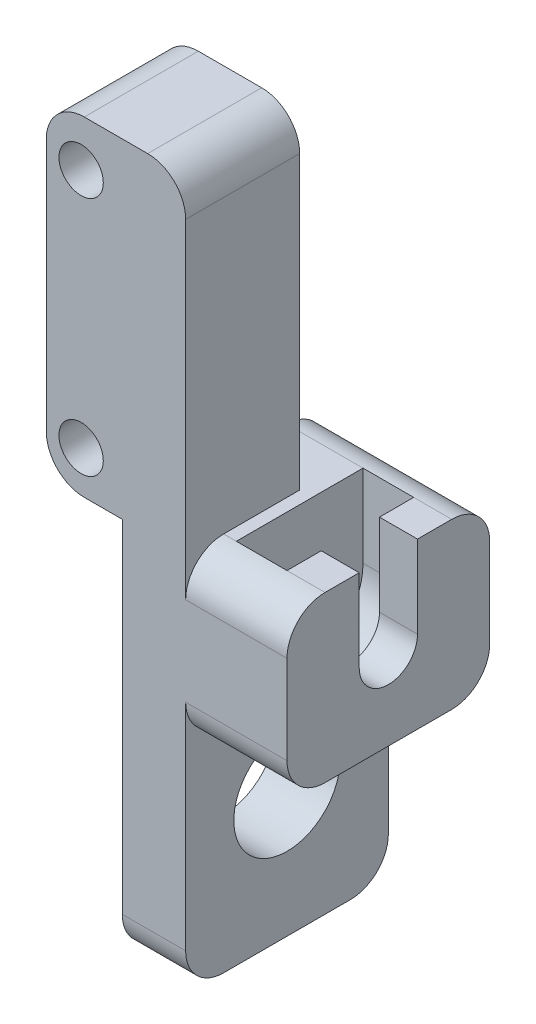
ISO-10303-21;
HEADER;
FILE_DESCRIPTION(('STEP AP214'),'2;1');
FILE_NAME('part.step','',(''),(''),'','','');
FILE_SCHEMA(('AUTOMOTIVE_DESIGN { 1 0 10303 214 1 1 1 1 }'));
ENDSEC;
DATA;
#1=APPLICATION_CONTEXT('core data for automotive mechanical design processes');
#2=APPLICATION_PROTOCOL_DEFINITION('international standard','automotive_design',2000,#1);
#3=PRODUCT_CONTEXT('',#1,'mechanical');
#4=PRODUCT('Part','Part','',(#3));
#5=PRODUCT_RELATED_PRODUCT_CATEGORY('part','',(#4));
#6=PRODUCT_DEFINITION_FORMATION('','',#4);
#7=PRODUCT_DEFINITION_CONTEXT('part definition',#1,'design');
#8=PRODUCT_DEFINITION('design','',#6,#7);
#9=PRODUCT_DEFINITION_SHAPE('','',#8);
#10=(LENGTH_UNIT() NAMED_UNIT(*) SI_UNIT(.MILLI.,.METRE.));
#11=(NAMED_UNIT(*) PLANE_ANGLE_UNIT() SI_UNIT($,.RADIAN.));
#12=(NAMED_UNIT(*) SI_UNIT($,.STERADIAN.) SOLID_ANGLE_UNIT());
#13=UNCERTAINTY_MEASURE_WITH_UNIT(LENGTH_MEASURE(1.E-05),#10,'distance_accuracy_value','');
#14=(GEOMETRIC_REPRESENTATION_CONTEXT(3) GLOBAL_UNCERTAINTY_ASSIGNED_CONTEXT((#13)) GLOBAL_UNIT_ASSIGNED_CONTEXT((#10,
#11,#12)) REPRESENTATION_CONTEXT('',''));
#15=CARTESIAN_POINT('',(0.,0.,0.));
#16=DIRECTION('',(0.,0.,1.));
#17=DIRECTION('',(1.,0.,0.));
#18=AXIS2_PLACEMENT_3D('',#15,#16,#17);
#19=CARTESIAN_POINT('',(5.,0.,0.));
#20=DIRECTION('',(0.,-1.,0.));
#21=DIRECTION('',(0.,0.,-1.));
#22=AXIS2_PLACEMENT_3D('',#19,#20,#21);
#23=PLANE('',#22);
#24=DIRECTION('',(0.,0.,1.));
#25=VECTOR('',#24,1.);
#26=CARTESIAN_POINT('',(5.,0.,-16.));
#27=LINE('',#26,#25);
#28=CARTESIAN_POINT('',(5.,0.,-9.));
#29=VERTEX_POINT('',#28);
#30=CARTESIAN_POINT('',(5.,0.,-3.));
#31=VERTEX_POINT('',#30);
#32=EDGE_CURVE('E304',#29,#31,#27,.T.);
#33=ORIENTED_EDGE('',*,*,#32,.T.);
#34=DIRECTION('',(-1.,0.,0.));
#35=VECTOR('',#34,1.);
#36=CARTESIAN_POINT('',(5.,0.,-3.));
#37=LINE('',#36,#35);
#38=CARTESIAN_POINT('',(6.,0.,-2.99999999999997));
#39=VERTEX_POINT('',#38);
#40=EDGE_CURVE('E404',#31,#39,#37,.F.);
#41=ORIENTED_EDGE('',*,*,#40,.T.);
#42=DIRECTION('',(0.,0.,-1.));
#43=VECTOR('',#42,1.);
#44=CARTESIAN_POINT('',(6.,0.,0.));
#45=LINE('',#44,#43);
#46=CARTESIAN_POINT('',(6.,0.,-13.));
#47=VERTEX_POINT('',#46);
#48=EDGE_CURVE('E277',#39,#47,#45,.T.);
#49=ORIENTED_EDGE('',*,*,#48,.T.);
#50=DIRECTION('',(-1.,0.,0.));
#51=VECTOR('',#50,1.);
#52=CARTESIAN_POINT('',(5.,0.,-13.));
#53=LINE('',#52,#51);
#54=CARTESIAN_POINT('',(0.,0.,-13.));
#55=VERTEX_POINT('',#54);
#56=EDGE_CURVE('E397',#47,#55,#53,.T.);
#57=ORIENTED_EDGE('',*,*,#56,.T.);
#58=DIRECTION('',(0.,0.,1.));
#59=VECTOR('',#58,1.);
#60=CARTESIAN_POINT('',(0.,0.,0.));
#61=LINE('',#60,#59);
#62=CARTESIAN_POINT('',(0.,0.,-9.));
#63=VERTEX_POINT('',#62);
#64=EDGE_CURVE('E365',#55,#63,#61,.T.);
#65=ORIENTED_EDGE('',*,*,#64,.T.);
#66=DIRECTION('',(-1.,0.,0.));
#67=VECTOR('',#66,1.);
#68=CARTESIAN_POINT('',(0.,0.,-9.));
#69=LINE('',#68,#67);
#70=EDGE_CURVE('E322',#29,#63,#69,.T.);
#71=ORIENTED_EDGE('',*,*,#70,.F.);
#72=EDGE_LOOP('',(#33,#41,#49,#57,#65,#71));
#73=FACE_BOUND('',#72,.T.);
#74=ADVANCED_FACE('F35',(#73),#23,.F.);
#75=DIRECTION('',(0.,0.,1.));
#76=VECTOR('',#75,1.);
#77=CARTESIAN_POINT('',(13.,0.,-16.));
#78=LINE('',#77,#76);
#79=CARTESIAN_POINT('',(13.,0.,-13.));
#80=VERTEX_POINT('',#79);
#81=CARTESIAN_POINT('',(13.,0.,-10.3));
#82=VERTEX_POINT('',#81);
#83=EDGE_CURVE('E295',#80,#82,#78,.T.);
#84=ORIENTED_EDGE('',*,*,#83,.F.);
#85=DIRECTION('',(-1.,0.,0.));
#86=VECTOR('',#85,1.);
#87=CARTESIAN_POINT('',(5.,0.,-13.));
#88=LINE('',#87,#86);
#89=CARTESIAN_POINT('',(10.,0.,-13.));
#90=VERTEX_POINT('',#89);
#91=EDGE_CURVE('E399',#80,#90,#88,.T.);
#92=ORIENTED_EDGE('',*,*,#91,.T.);
#93=DIRECTION('',(0.,0.,-1.));
#94=VECTOR('',#93,1.);
#95=CARTESIAN_POINT('',(10.,0.,0.));
#96=LINE('',#95,#94);
#97=CARTESIAN_POINT('',(10.,0.,-10.3));
#98=VERTEX_POINT('',#97);
#99=EDGE_CURVE('E264',#98,#90,#96,.T.);
#100=ORIENTED_EDGE('',*,*,#99,.F.);
#101=DIRECTION('',(1.,0.,0.));
#102=VECTOR('',#101,1.);
#103=CARTESIAN_POINT('',(-3.92975326984514,0.,-10.3));
#104=LINE('',#103,#102);
#105=EDGE_CURVE('E247',#98,#82,#104,.T.);
#106=ORIENTED_EDGE('',*,*,#105,.T.);
#107=EDGE_LOOP('',(#84,#92,#100,#106));
#108=FACE_BOUND('',#107,.T.);
#109=ADVANCED_FACE('F471',(#108),#23,.F.);
#110=CARTESIAN_POINT('',(10.,0.,-2.99999999999997));
#111=VERTEX_POINT('',#110);
#112=CARTESIAN_POINT('',(10.,0.,-5.69999999999997));
#113=VERTEX_POINT('',#112);
#114=EDGE_CURVE('E265',#111,#113,#96,.T.);
#115=ORIENTED_EDGE('',*,*,#114,.F.);
#116=DIRECTION('',(-1.,0.,0.));
#117=VECTOR('',#116,1.);
#118=CARTESIAN_POINT('',(5.,0.,-3.));
#119=LINE('',#118,#117);
#120=CARTESIAN_POINT('',(13.,0.,-3.));
#121=VERTEX_POINT('',#120);
#122=EDGE_CURVE('E402',#111,#121,#119,.F.);
#123=ORIENTED_EDGE('',*,*,#122,.T.);
#124=CARTESIAN_POINT('',(13.,0.,-5.69999999999997));
#125=VERTEX_POINT('',#124);
#126=EDGE_CURVE('E294',#125,#121,#78,.T.);
#127=ORIENTED_EDGE('',*,*,#126,.F.);
#128=DIRECTION('',(1.,0.,0.));
#129=VECTOR('',#128,1.);
#130=CARTESIAN_POINT('',(-3.92975326984514,0.,-5.69999999999997));
#131=LINE('',#130,#129);
#132=EDGE_CURVE('E236',#113,#125,#131,.T.);
#133=ORIENTED_EDGE('',*,*,#132,.F.);
#134=EDGE_LOOP('',(#115,#123,#127,#133));
#135=FACE_BOUND('',#134,.T.);
#136=ADVANCED_FACE('F482',(#135),#23,.F.);
#137=CARTESIAN_POINT('',(13.,0.,0.));
#138=DIRECTION('',(-1.,0.,0.));
#139=DIRECTION('',(0.,0.,1.));
#140=AXIS2_PLACEMENT_3D('',#137,#138,#139);
#141=PLANE('',#140);
#142=ORIENTED_EDGE('',*,*,#126,.T.);
#143=CARTESIAN_POINT('',(13.,-3.,-3.));
#144=DIRECTION('',(-1.,0.,0.));
#145=DIRECTION('',(0.,0.,1.));
#146=AXIS2_PLACEMENT_3D('',#143,#144,#145);
#147=CIRCLE('',#146,3.);
#148=CARTESIAN_POINT('',(13.,-3.,0.));
#149=VERTEX_POINT('',#148);
#150=EDGE_CURVE('E412',#121,#149,#147,.F.);
#151=ORIENTED_EDGE('',*,*,#150,.T.);
#152=DIRECTION('',(0.,-1.,0.));
#153=VECTOR('',#152,1.);
#154=CARTESIAN_POINT('',(13.,0.,0.));
#155=LINE('',#154,#153);
#156=CARTESIAN_POINT('',(13.,-10.,0.));
#157=VERTEX_POINT('',#156);
#158=EDGE_CURVE('E297',#149,#157,#155,.T.);
#159=ORIENTED_EDGE('',*,*,#158,.T.);
#160=CARTESIAN_POINT('',(13.,-10.,-3.));
#161=DIRECTION('',(-1.,0.,0.));
#162=DIRECTION('',(0.,0.,1.));
#163=AXIS2_PLACEMENT_3D('',#160,#161,#162);
#164=CIRCLE('',#163,3.);
#165=CARTESIAN_POINT('',(13.,-13.,-3.));
#166=VERTEX_POINT('',#165);
#167=EDGE_CURVE('E406',#157,#166,#164,.F.);
#168=ORIENTED_EDGE('',*,*,#167,.T.);
#169=DIRECTION('',(0.,0.,-1.));
#170=VECTOR('',#169,1.);
#171=CARTESIAN_POINT('',(13.,-13.,-16.));
#172=LINE('',#171,#170);
#173=CARTESIAN_POINT('',(13.,-13.,-13.));
#174=VERTEX_POINT('',#173);
#175=EDGE_CURVE('E300',#166,#174,#172,.T.);
#176=ORIENTED_EDGE('',*,*,#175,.T.);
#177=CARTESIAN_POINT('',(13.,-10.,-13.));
#178=DIRECTION('',(-1.,0.,0.));
#179=DIRECTION('',(0.,0.,1.));
#180=AXIS2_PLACEMENT_3D('',#177,#178,#179);
#181=CIRCLE('',#180,3.);
#182=CARTESIAN_POINT('',(13.,-9.99999999999999,-16.));
#183=VERTEX_POINT('',#182);
#184=EDGE_CURVE('E408',#174,#183,#181,.F.);
#185=ORIENTED_EDGE('',*,*,#184,.T.);
#186=DIRECTION('',(0.,1.,0.));
#187=VECTOR('',#186,1.);
#188=CARTESIAN_POINT('',(13.,0.,-16.));
#189=LINE('',#188,#187);
#190=CARTESIAN_POINT('',(13.,-3.,-16.));
#191=VERTEX_POINT('',#190);
#192=EDGE_CURVE('E291',#183,#191,#189,.T.);
#193=ORIENTED_EDGE('',*,*,#192,.T.);
#194=CARTESIAN_POINT('',(13.,-3.,-13.));
#195=DIRECTION('',(-1.,0.,0.));
#196=DIRECTION('',(0.,0.,1.));
#197=AXIS2_PLACEMENT_3D('',#194,#195,#196);
#198=CIRCLE('',#197,3.);
#199=EDGE_CURVE('E410',#191,#80,#198,.F.);
#200=ORIENTED_EDGE('',*,*,#199,.T.);
#201=ORIENTED_EDGE('',*,*,#83,.T.);
#202=DIRECTION('',(0.,1.,0.));
#203=VECTOR('',#202,1.);
#204=CARTESIAN_POINT('',(13.,0.,-10.3));
#205=LINE('',#204,#203);
#206=CARTESIAN_POINT('',(13.,-6.5,-10.3));
#207=VERTEX_POINT('',#206);
#208=EDGE_CURVE('E230',#207,#82,#205,.T.);
#209=ORIENTED_EDGE('',*,*,#208,.F.);
#210=CARTESIAN_POINT('',(13.,-6.5,-7.99999999999997));
#211=DIRECTION('',(1.,0.,0.));
#212=DIRECTION('',(0.,0.,-1.));
#213=AXIS2_PLACEMENT_3D('',#210,#211,#212);
#214=CIRCLE('',#213,2.3);
#215=CARTESIAN_POINT('',(13.,-6.5,-5.69999999999997));
#216=VERTEX_POINT('',#215);
#217=EDGE_CURVE('E223',#216,#207,#214,.T.);
#218=ORIENTED_EDGE('',*,*,#217,.F.);
#219=DIRECTION('',(0.,1.,0.));
#220=VECTOR('',#219,1.);
#221=CARTESIAN_POINT('',(13.,0.,-5.69999999999997));
#222=LINE('',#221,#220);
#223=EDGE_CURVE('E233',#216,#125,#222,.T.);
#224=ORIENTED_EDGE('',*,*,#223,.T.);
#225=EDGE_LOOP('',(#142,#151,#159,#168,#176,#185,#193,#200,#201,#209,#218,#224));
#226=FACE_BOUND('',#225,.T.);
#227=ADVANCED_FACE('F241',(#226),#141,.F.);
#228=CARTESIAN_POINT('',(10.,0.,0.));
#229=DIRECTION('',(1.,0.,0.));
#230=DIRECTION('',(0.,0.,-1.));
#231=AXIS2_PLACEMENT_3D('',#228,#229,#230);
#232=PLANE('',#231);
#233=DIRECTION('',(0.,1.,0.));
#234=VECTOR('',#233,1.);
#235=CARTESIAN_POINT('',(10.,0.,-5.69999999999997));
#236=LINE('',#235,#234);
#237=CARTESIAN_POINT('',(10.,-6.5,-5.69999999999997));
#238=VERTEX_POINT('',#237);
#239=EDGE_CURVE('E255',#238,#113,#236,.T.);
#240=ORIENTED_EDGE('',*,*,#239,.F.);
#241=CARTESIAN_POINT('',(10.,-6.5,-7.99999999999997));
#242=DIRECTION('',(1.,0.,0.));
#243=DIRECTION('',(0.,0.,-1.));
#244=AXIS2_PLACEMENT_3D('',#241,#242,#243);
#245=CIRCLE('',#244,2.3);
#246=CARTESIAN_POINT('',(10.,-6.5,-10.3));
#247=VERTEX_POINT('',#246);
#248=EDGE_CURVE('E226',#238,#247,#245,.T.);
#249=ORIENTED_EDGE('',*,*,#248,.T.);
#250=DIRECTION('',(0.,1.,0.));
#251=VECTOR('',#250,1.);
#252=CARTESIAN_POINT('',(10.,0.,-10.3));
#253=LINE('',#252,#251);
#254=EDGE_CURVE('E252',#247,#98,#253,.T.);
#255=ORIENTED_EDGE('',*,*,#254,.T.);
#256=ORIENTED_EDGE('',*,*,#99,.T.);
#257=DIRECTION('',(0.,-1.,0.));
#258=VECTOR('',#257,1.);
#259=CARTESIAN_POINT('',(10.,0.,-13.));
#260=LINE('',#259,#258);
#261=CARTESIAN_POINT('',(10.,-6.5,-13.));
#262=VERTEX_POINT('',#261);
#263=EDGE_CURVE('E260',#90,#262,#260,.T.);
#264=ORIENTED_EDGE('',*,*,#263,.T.);
#265=CARTESIAN_POINT('',(10.,-6.5,-7.99999999999997));
#266=DIRECTION('',(1.,0.,0.));
#267=DIRECTION('',(0.,0.,-1.));
#268=AXIS2_PLACEMENT_3D('',#265,#266,#267);
#269=CIRCLE('',#268,5.);
#270=CARTESIAN_POINT('',(10.,-6.5,-2.99999999999997));
#271=VERTEX_POINT('',#270);
#272=EDGE_CURVE('E258',#271,#262,#269,.T.);
#273=ORIENTED_EDGE('',*,*,#272,.F.);
#274=DIRECTION('',(0.,1.,0.));
#275=VECTOR('',#274,1.);
#276=CARTESIAN_POINT('',(10.,0.,-2.99999999999997));
#277=LINE('',#276,#275);
#278=EDGE_CURVE('E268',#271,#111,#277,.T.);
#279=ORIENTED_EDGE('',*,*,#278,.T.);
#280=ORIENTED_EDGE('',*,*,#114,.T.);
#281=EDGE_LOOP('',(#240,#249,#255,#256,#264,#273,#279,#280));
#282=FACE_BOUND('',#281,.T.);
#283=ADVANCED_FACE('F478',(#282),#232,.F.);
#284=CARTESIAN_POINT('',(5.,0.,0.));
#285=DIRECTION('',(1.,0.,0.));
#286=DIRECTION('',(0.,0.,-1.));
#287=AXIS2_PLACEMENT_3D('',#284,#285,#286);
#288=PLANE('',#287);
#289=DIRECTION('',(0.,0.,-1.));
#290=VECTOR('',#289,1.);
#291=CARTESIAN_POINT('',(5.,-30.,0.));
#292=LINE('',#291,#290);
#293=CARTESIAN_POINT('',(5.,-30.,-3.));
#294=VERTEX_POINT('',#293);
#295=CARTESIAN_POINT('',(5.,-30.,-13.));
#296=VERTEX_POINT('',#295);
#297=EDGE_CURVE('E353',#294,#296,#292,.T.);
#298=ORIENTED_EDGE('',*,*,#297,.T.);
#299=CARTESIAN_POINT('',(5.,-27.,-13.));
#300=DIRECTION('',(1.,0.,0.));
#301=DIRECTION('',(0.,0.,-1.));
#302=AXIS2_PLACEMENT_3D('',#299,#300,#301);
#303=CIRCLE('',#302,3.);
#304=CARTESIAN_POINT('',(5.,-27.,-16.));
#305=VERTEX_POINT('',#304);
#306=EDGE_CURVE('E441',#296,#305,#303,.T.);
#307=ORIENTED_EDGE('',*,*,#306,.T.);
#308=DIRECTION('',(0.,1.,0.));
#309=VECTOR('',#308,1.);
#310=CARTESIAN_POINT('',(5.,0.,-16.));
#311=LINE('',#310,#309);
#312=CARTESIAN_POINT('',(5.,-10.,-16.));
#313=VERTEX_POINT('',#312);
#314=EDGE_CURVE('E308',#305,#313,#311,.T.);
#315=ORIENTED_EDGE('',*,*,#314,.T.);
#316=CARTESIAN_POINT('',(5.,-10.,-13.));
#317=DIRECTION('',(1.,0.,0.));
#318=DIRECTION('',(0.,0.,-1.));
#319=AXIS2_PLACEMENT_3D('',#316,#317,#318);
#320=CIRCLE('',#319,3.);
#321=CARTESIAN_POINT('',(5.,-13.,-13.));
#322=VERTEX_POINT('',#321);
#323=EDGE_CURVE('E43',#313,#322,#320,.F.);
#324=ORIENTED_EDGE('',*,*,#323,.T.);
#325=DIRECTION('',(0.,0.,-1.));
#326=VECTOR('',#325,1.);
#327=CARTESIAN_POINT('',(5.,-13.,-16.));
#328=LINE('',#327,#326);
#329=CARTESIAN_POINT('',(5.,-13.,-3.));
#330=VERTEX_POINT('',#329);
#331=EDGE_CURVE('E290',#330,#322,#328,.T.);
#332=ORIENTED_EDGE('',*,*,#331,.F.);
#333=CARTESIAN_POINT('',(5.,-10.,-3.));
#334=DIRECTION('',(1.,0.,0.));
#335=DIRECTION('',(0.,0.,-1.));
#336=AXIS2_PLACEMENT_3D('',#333,#334,#335);
#337=CIRCLE('',#336,3.);
#338=CARTESIAN_POINT('',(5.,-10.,0.));
#339=VERTEX_POINT('',#338);
#340=EDGE_CURVE('E11',#330,#339,#337,.F.);
#341=ORIENTED_EDGE('',*,*,#340,.T.);
#342=DIRECTION('',(0.,-1.,0.));
#343=VECTOR('',#342,1.);
#344=CARTESIAN_POINT('',(5.,0.,0.));
#345=LINE('',#344,#343);
#346=CARTESIAN_POINT('',(5.,-27.,0.));
#347=VERTEX_POINT('',#346);
#348=EDGE_CURVE('E354',#339,#347,#345,.T.);
#349=ORIENTED_EDGE('',*,*,#348,.T.);
#350=CARTESIAN_POINT('',(5.,-27.,-3.));
#351=DIRECTION('',(1.,0.,0.));
#352=DIRECTION('',(0.,0.,-1.));
#353=AXIS2_PLACEMENT_3D('',#350,#351,#352);
#354=CIRCLE('',#353,3.);
#355=EDGE_CURVE('E57',#347,#294,#354,.T.);
#356=ORIENTED_EDGE('',*,*,#355,.T.);
#357=EDGE_LOOP('',(#298,#307,#315,#324,#332,#341,#349,#356));
#358=FACE_BOUND('',#357,.T.);
#359=CARTESIAN_POINT('',(5.,-20.,-8.));
#360=DIRECTION('',(1.,0.,0.));
#361=DIRECTION('',(0.,0.,-1.));
#362=AXIS2_PLACEMENT_3D('',#359,#360,#361);
#363=CIRCLE('',#362,4.2);
#364=CARTESIAN_POINT('',(5.,-20.,-12.2));
#365=VERTEX_POINT('',#364);
#366=EDGE_CURVE('E345',#365,#365,#363,.T.);
#367=ORIENTED_EDGE('',*,*,#366,.F.);
#368=EDGE_LOOP('',(#367));
#369=FACE_BOUND('',#368,.T.);
#370=ADVANCED_FACE('F446',(#358,#369),#288,.T.);
#371=DIRECTION('',(0.,1.,0.));
#372=VECTOR('',#371,1.);
#373=CARTESIAN_POINT('',(5.,0.,-9.));
#374=LINE('',#373,#372);
#375=CARTESIAN_POINT('',(5.,23.,-9.));
#376=VERTEX_POINT('',#375);
#377=EDGE_CURVE('E325',#29,#376,#374,.T.);
#378=ORIENTED_EDGE('',*,*,#377,.T.);
#379=DIRECTION('',(0.,0.,1.));
#380=VECTOR('',#379,1.);
#381=CARTESIAN_POINT('',(5.,23.,0.));
#382=LINE('',#381,#380);
#383=CARTESIAN_POINT('',(5.,23.,0.));
#384=VERTEX_POINT('',#383);
#385=EDGE_CURVE('E428',#376,#384,#382,.T.);
#386=ORIENTED_EDGE('',*,*,#385,.T.);
#387=CARTESIAN_POINT('',(5.,-3.,0.));
#388=VERTEX_POINT('',#387);
#389=EDGE_CURVE('E351',#384,#388,#345,.T.);
#390=ORIENTED_EDGE('',*,*,#389,.T.);
#391=CARTESIAN_POINT('',(5.,-3.,-3.));
#392=DIRECTION('',(1.,0.,0.));
#393=DIRECTION('',(0.,0.,-1.));
#394=AXIS2_PLACEMENT_3D('',#391,#392,#393);
#395=CIRCLE('',#394,3.);
#396=EDGE_CURVE('E443',#388,#31,#395,.F.);
#397=ORIENTED_EDGE('',*,*,#396,.T.);
#398=ORIENTED_EDGE('',*,*,#32,.F.);
#399=EDGE_LOOP('',(#378,#386,#390,#397,#398));
#400=FACE_BOUND('',#399,.T.);
#401=ADVANCED_FACE('F570',(#400),#288,.T.);
#402=CARTESIAN_POINT('',(0.,0.,0.));
#403=DIRECTION('',(1.,0.,0.));
#404=DIRECTION('',(0.,0.,-1.));
#405=AXIS2_PLACEMENT_3D('',#402,#403,#404);
#406=PLANE('',#405);
#407=ORIENTED_EDGE('',*,*,#64,.F.);
#408=CARTESIAN_POINT('',(0.,-3.,-13.));
#409=DIRECTION('',(1.,0.,0.));
#410=DIRECTION('',(0.,0.,-1.));
#411=AXIS2_PLACEMENT_3D('',#408,#409,#410);
#412=CIRCLE('',#411,3.);
#413=CARTESIAN_POINT('',(0.,-3.,-16.));
#414=VERTEX_POINT('',#413);
#415=EDGE_CURVE('E418',#55,#414,#412,.F.);
#416=ORIENTED_EDGE('',*,*,#415,.T.);
#417=DIRECTION('',(0.,1.,0.));
#418=VECTOR('',#417,1.);
#419=CARTESIAN_POINT('',(0.,0.,-16.));
#420=LINE('',#419,#418);
#421=CARTESIAN_POINT('',(0.,-27.,-16.));
#422=VERTEX_POINT('',#421);
#423=EDGE_CURVE('E361',#422,#414,#420,.T.);
#424=ORIENTED_EDGE('',*,*,#423,.F.);
#425=CARTESIAN_POINT('',(0.,-27.,-13.));
#426=DIRECTION('',(1.,0.,0.));
#427=DIRECTION('',(0.,0.,-1.));
#428=AXIS2_PLACEMENT_3D('',#425,#426,#427);
#429=CIRCLE('',#428,3.);
#430=CARTESIAN_POINT('',(0.,-30.,-13.));
#431=VERTEX_POINT('',#430);
#432=EDGE_CURVE('E416',#422,#431,#429,.F.);
#433=ORIENTED_EDGE('',*,*,#432,.T.);
#434=DIRECTION('',(0.,0.,-1.));
#435=VECTOR('',#434,1.);
#436=CARTESIAN_POINT('',(0.,-30.,0.));
#437=LINE('',#436,#435);
#438=CARTESIAN_POINT('',(0.,-30.,-3.));
#439=VERTEX_POINT('',#438);
#440=EDGE_CURVE('E359',#439,#431,#437,.T.);
#441=ORIENTED_EDGE('',*,*,#440,.F.);
#442=CARTESIAN_POINT('',(0.,-27.,-3.));
#443=DIRECTION('',(1.,0.,0.));
#444=DIRECTION('',(0.,0.,-1.));
#445=AXIS2_PLACEMENT_3D('',#442,#443,#444);
#446=CIRCLE('',#445,3.);
#447=CARTESIAN_POINT('',(0.,-27.,0.));
#448=VERTEX_POINT('',#447);
#449=EDGE_CURVE('E414',#439,#448,#446,.F.);
#450=ORIENTED_EDGE('',*,*,#449,.T.);
#451=DIRECTION('',(0.,-1.,0.));
#452=VECTOR('',#451,1.);
#453=CARTESIAN_POINT('',(0.,0.,0.));
#454=LINE('',#453,#452);
#455=CARTESIAN_POINT('',(0.,0.,0.));
#456=VERTEX_POINT('',#455);
#457=EDGE_CURVE('E348',#456,#448,#454,.T.);
#458=ORIENTED_EDGE('',*,*,#457,.F.);
#459=EDGE_CURVE('E364',#63,#456,#61,.T.);
#460=ORIENTED_EDGE('',*,*,#459,.F.);
#461=EDGE_LOOP('',(#407,#416,#424,#433,#441,#450,#458,#460));
#462=FACE_BOUND('',#461,.T.);
#463=CARTESIAN_POINT('',(0.,-20.,-8.));
#464=DIRECTION('',(1.,0.,0.));
#465=DIRECTION('',(0.,0.,-1.));
#466=AXIS2_PLACEMENT_3D('',#463,#464,#465);
#467=CIRCLE('',#466,4.2);
#468=CARTESIAN_POINT('',(0.,-20.,-12.2));
#469=VERTEX_POINT('',#468);
#470=EDGE_CURVE('E331',#469,#469,#467,.T.);
#471=ORIENTED_EDGE('',*,*,#470,.T.);
#472=EDGE_LOOP('',(#471));
#473=FACE_BOUND('',#472,.T.);
#474=ADVANCED_FACE('F506',(#462,#473),#406,.F.);
#475=CARTESIAN_POINT('',(5.,0.,0.));
#476=DIRECTION('',(0.,0.,-1.));
#477=DIRECTION('',(0.,1.,0.));
#478=AXIS2_PLACEMENT_3D('',#475,#476,#477);
#479=PLANE('',#478);
#480=DIRECTION('',(-1.,0.,0.));
#481=VECTOR('',#480,1.);
#482=CARTESIAN_POINT('',(0.,26.,0.));
#483=LINE('',#482,#481);
#484=CARTESIAN_POINT('',(2.,26.,0.));
#485=VERTEX_POINT('',#484);
#486=CARTESIAN_POINT('',(-3.,26.,0.));
#487=VERTEX_POINT('',#486);
#488=EDGE_CURVE('E315',#485,#487,#483,.T.);
#489=ORIENTED_EDGE('',*,*,#488,.T.);
#490=CARTESIAN_POINT('',(-3.,23.,0.));
#491=DIRECTION('',(0.,0.,-1.));
#492=DIRECTION('',(0.,1.,0.));
#493=AXIS2_PLACEMENT_3D('',#490,#491,#492);
#494=CIRCLE('',#493,3.);
#495=CARTESIAN_POINT('',(-6.,23.,0.));
#496=VERTEX_POINT('',#495);
#497=EDGE_CURVE('E382',#487,#496,#494,.F.);
#498=ORIENTED_EDGE('',*,*,#497,.T.);
#499=DIRECTION('',(0.,1.,0.));
#500=VECTOR('',#499,1.);
#501=CARTESIAN_POINT('',(-6.,0.,0.));
#502=LINE('',#501,#500);
#503=CARTESIAN_POINT('',(-6.,3.,0.));
#504=VERTEX_POINT('',#503);
#505=EDGE_CURVE('E337',#504,#496,#502,.T.);
#506=ORIENTED_EDGE('',*,*,#505,.F.);
#507=CARTESIAN_POINT('',(-3.,3.,0.));
#508=DIRECTION('',(0.,0.,-1.));
#509=DIRECTION('',(0.,1.,0.));
#510=AXIS2_PLACEMENT_3D('',#507,#508,#509);
#511=CIRCLE('',#510,3.);
#512=CARTESIAN_POINT('',(-3.,0.,0.));
#513=VERTEX_POINT('',#512);
#514=EDGE_CURVE('E380',#504,#513,#511,.F.);
#515=ORIENTED_EDGE('',*,*,#514,.T.);
#516=DIRECTION('',(-1.,0.,0.));
#517=VECTOR('',#516,1.);
#518=CARTESIAN_POINT('',(0.,0.,0.));
#519=LINE('',#518,#517);
#520=EDGE_CURVE('E340',#456,#513,#519,.T.);
#521=ORIENTED_EDGE('',*,*,#520,.F.);
#522=ORIENTED_EDGE('',*,*,#457,.T.);
#523=DIRECTION('',(-1.,0.,0.));
#524=VECTOR('',#523,1.);
#525=CARTESIAN_POINT('',(5.,-27.,0.));
#526=LINE('',#525,#524);
#527=EDGE_CURVE('E371',#448,#347,#526,.F.);
#528=ORIENTED_EDGE('',*,*,#527,.T.);
#529=ORIENTED_EDGE('',*,*,#348,.F.);
#530=DIRECTION('',(-1.,0.,0.));
#531=VECTOR('',#530,1.);
#532=CARTESIAN_POINT('',(5.,-10.,0.));
#533=LINE('',#532,#531);
#534=EDGE_CURVE('E373',#339,#157,#533,.F.);
#535=ORIENTED_EDGE('',*,*,#534,.T.);
#536=ORIENTED_EDGE('',*,*,#158,.F.);
#537=DIRECTION('',(-1.,0.,0.));
#538=VECTOR('',#537,1.);
#539=CARTESIAN_POINT('',(5.,-3.,0.));
#540=LINE('',#539,#538);
#541=EDGE_CURVE('E377',#149,#388,#540,.T.);
#542=ORIENTED_EDGE('',*,*,#541,.T.);
#543=ORIENTED_EDGE('',*,*,#389,.F.);
#544=CARTESIAN_POINT('',(2.,23.,0.));
#545=DIRECTION('',(0.,0.,-1.));
#546=DIRECTION('',(0.,1.,0.));
#547=AXIS2_PLACEMENT_3D('',#544,#545,#546);
#548=CIRCLE('',#547,3.);
#549=EDGE_CURVE('E375',#384,#485,#548,.F.);
#550=ORIENTED_EDGE('',*,*,#549,.T.);
#551=EDGE_LOOP('',(#489,#498,#506,#515,#521,#522,#528,#529,#535,#536,#542,#543,#550));
#552=FACE_BOUND('',#551,.T.);
#553=CARTESIAN_POINT('',(-3.25,3.25,0.));
#554=DIRECTION('',(0.,0.,1.));
#555=DIRECTION('',(1.,0.,0.));
#556=AXIS2_PLACEMENT_3D('',#553,#554,#555);
#557=CIRCLE('',#556,1.75);
#558=CARTESIAN_POINT('',(-1.5,3.25,0.));
#559=VERTEX_POINT('',#558);
#560=EDGE_CURVE('E303',#559,#559,#557,.T.);
#561=ORIENTED_EDGE('',*,*,#560,.F.);
#562=EDGE_LOOP('',(#561));
#563=FACE_BOUND('',#562,.T.);
#564=CARTESIAN_POINT('',(-3.25,22.25,0.));
#565=DIRECTION('',(0.,0.,1.));
#566=DIRECTION('',(1.,0.,0.));
#567=AXIS2_PLACEMENT_3D('',#564,#565,#566);
#568=CIRCLE('',#567,1.75);
#569=CARTESIAN_POINT('',(-1.5,22.25,0.));
#570=VERTEX_POINT('',#569);
#571=EDGE_CURVE('E334',#570,#570,#568,.T.);
#572=ORIENTED_EDGE('',*,*,#571,.F.);
#573=EDGE_LOOP('',(#572));
#574=FACE_BOUND('',#573,.T.);
#575=ADVANCED_FACE('F493',(#552,#563,#574),#479,.F.);
#576=CARTESIAN_POINT('',(5.,-30.,0.));
#577=DIRECTION('',(0.,1.,0.));
#578=DIRECTION('',(0.,0.,1.));
#579=AXIS2_PLACEMENT_3D('',#576,#577,#578);
#580=PLANE('',#579);
#581=ORIENTED_EDGE('',*,*,#440,.T.);
#582=DIRECTION('',(-1.,0.,0.));
#583=VECTOR('',#582,1.);
#584=CARTESIAN_POINT('',(5.,-30.,-13.));
#585=LINE('',#584,#583);
#586=EDGE_CURVE('E50',#431,#296,#585,.F.);
#587=ORIENTED_EDGE('',*,*,#586,.T.);
#588=ORIENTED_EDGE('',*,*,#297,.F.);
#589=DIRECTION('',(-1.,0.,0.));
#590=VECTOR('',#589,1.);
#591=CARTESIAN_POINT('',(5.,-30.,-3.));
#592=LINE('',#591,#590);
#593=EDGE_CURVE('E436',#294,#439,#592,.T.);
#594=ORIENTED_EDGE('',*,*,#593,.T.);
#595=EDGE_LOOP('',(#581,#587,#588,#594));
#596=FACE_BOUND('',#595,.T.);
#597=ADVANCED_FACE('F503',(#596),#580,.F.);
#598=CARTESIAN_POINT('',(5.,0.,-16.));
#599=DIRECTION('',(0.,0.,1.));
#600=DIRECTION('',(0.,-1.,0.));
#601=AXIS2_PLACEMENT_3D('',#598,#599,#600);
#602=PLANE('',#601);
#603=ORIENTED_EDGE('',*,*,#423,.T.);
#604=DIRECTION('',(-1.,0.,0.));
#605=VECTOR('',#604,1.);
#606=CARTESIAN_POINT('',(5.,-3.,-16.));
#607=LINE('',#606,#605);
#608=EDGE_CURVE('E426',#414,#191,#607,.F.);
#609=ORIENTED_EDGE('',*,*,#608,.T.);
#610=ORIENTED_EDGE('',*,*,#192,.F.);
#611=DIRECTION('',(-1.,0.,0.));
#612=VECTOR('',#611,1.);
#613=CARTESIAN_POINT('',(5.,-10.,-16.));
#614=LINE('',#613,#612);
#615=EDGE_CURVE('E423',#183,#313,#614,.T.);
#616=ORIENTED_EDGE('',*,*,#615,.T.);
#617=ORIENTED_EDGE('',*,*,#314,.F.);
#618=DIRECTION('',(-1.,0.,0.));
#619=VECTOR('',#618,1.);
#620=CARTESIAN_POINT('',(5.,-27.,-16.));
#621=LINE('',#620,#619);
#622=EDGE_CURVE('E420',#305,#422,#621,.T.);
#623=ORIENTED_EDGE('',*,*,#622,.T.);
#624=EDGE_LOOP('',(#603,#609,#610,#616,#617,#623));
#625=FACE_BOUND('',#624,.T.);
#626=ADVANCED_FACE('F461',(#625),#602,.F.);
#627=CARTESIAN_POINT('',(5.,-20.,-8.));
#628=DIRECTION('',(-1.,0.,0.));
#629=DIRECTION('',(0.,0.,1.));
#630=AXIS2_PLACEMENT_3D('',#627,#628,#629);
#631=CYLINDRICAL_SURFACE('',#630,4.2);
#632=ORIENTED_EDGE('',*,*,#366,.T.);
#633=EDGE_LOOP('',(#632));
#634=FACE_BOUND('',#633,.T.);
#635=ORIENTED_EDGE('',*,*,#470,.F.);
#636=EDGE_LOOP('',(#635));
#637=FACE_BOUND('',#636,.T.);
#638=ADVANCED_FACE('F556',(#634,#637),#631,.F.);
#639=CARTESIAN_POINT('',(0.,0.,-9.));
#640=DIRECTION('',(0.,1.,0.));
#641=DIRECTION('',(-1.,0.,0.));
#642=AXIS2_PLACEMENT_3D('',#639,#640,#641);
#643=PLANE('',#642);
#644=ORIENTED_EDGE('',*,*,#520,.T.);
#645=DIRECTION('',(0.,0.,1.));
#646=VECTOR('',#645,1.);
#647=CARTESIAN_POINT('',(-3.,0.,-9.));
#648=LINE('',#647,#646);
#649=CARTESIAN_POINT('',(-3.,0.,-9.));
#650=VERTEX_POINT('',#649);
#651=EDGE_CURVE('E395',#513,#650,#648,.F.);
#652=ORIENTED_EDGE('',*,*,#651,.T.);
#653=EDGE_CURVE('E321',#63,#650,#69,.T.);
#654=ORIENTED_EDGE('',*,*,#653,.F.);
#655=ORIENTED_EDGE('',*,*,#459,.T.);
#656=EDGE_LOOP('',(#644,#652,#654,#655));
#657=FACE_BOUND('',#656,.T.);
#658=ADVANCED_FACE('F553',(#657),#643,.F.);
#659=CARTESIAN_POINT('',(-6.,0.,-9.));
#660=DIRECTION('',(1.,0.,0.));
#661=DIRECTION('',(0.,0.,-1.));
#662=AXIS2_PLACEMENT_3D('',#659,#660,#661);
#663=PLANE('',#662);
#664=ORIENTED_EDGE('',*,*,#505,.T.);
#665=DIRECTION('',(0.,0.,1.));
#666=VECTOR('',#665,1.);
#667=CARTESIAN_POINT('',(-6.,23.,-9.));
#668=LINE('',#667,#666);
#669=CARTESIAN_POINT('',(-6.,23.,-9.));
#670=VERTEX_POINT('',#669);
#671=EDGE_CURVE('E387',#496,#670,#668,.F.);
#672=ORIENTED_EDGE('',*,*,#671,.T.);
#673=DIRECTION('',(0.,1.,0.));
#674=VECTOR('',#673,1.);
#675=CARTESIAN_POINT('',(-6.,0.,-9.));
#676=LINE('',#675,#674);
#677=CARTESIAN_POINT('',(-6.,3.,-9.));
#678=VERTEX_POINT('',#677);
#679=EDGE_CURVE('E318',#678,#670,#676,.T.);
#680=ORIENTED_EDGE('',*,*,#679,.F.);
#681=DIRECTION('',(0.,0.,1.));
#682=VECTOR('',#681,1.);
#683=CARTESIAN_POINT('',(-6.,3.,-9.));
#684=LINE('',#683,#682);
#685=EDGE_CURVE('E384',#678,#504,#684,.T.);
#686=ORIENTED_EDGE('',*,*,#685,.T.);
#687=EDGE_LOOP('',(#664,#672,#680,#686));
#688=FACE_BOUND('',#687,.T.);
#689=ADVANCED_FACE('F551',(#688),#663,.F.);
#690=CARTESIAN_POINT('',(0.,26.,-9.));
#691=DIRECTION('',(0.,1.,0.));
#692=DIRECTION('',(0.,0.,1.));
#693=AXIS2_PLACEMENT_3D('',#690,#691,#692);
#694=PLANE('',#693);
#695=DIRECTION('',(-1.,0.,0.));
#696=VECTOR('',#695,1.);
#697=CARTESIAN_POINT('',(0.,26.,-9.));
#698=LINE('',#697,#696);
#699=CARTESIAN_POINT('',(2.,26.,-9.));
#700=VERTEX_POINT('',#699);
#701=CARTESIAN_POINT('',(-3.,26.,-9.));
#702=VERTEX_POINT('',#701);
#703=EDGE_CURVE('E328',#700,#702,#698,.T.);
#704=ORIENTED_EDGE('',*,*,#703,.T.);
#705=DIRECTION('',(0.,0.,1.));
#706=VECTOR('',#705,1.);
#707=CARTESIAN_POINT('',(-3.,26.,0.));
#708=LINE('',#707,#706);
#709=EDGE_CURVE('E368',#702,#487,#708,.T.);
#710=ORIENTED_EDGE('',*,*,#709,.T.);
#711=ORIENTED_EDGE('',*,*,#488,.F.);
#712=DIRECTION('',(0.,0.,1.));
#713=VECTOR('',#712,1.);
#714=CARTESIAN_POINT('',(2.,26.,-9.));
#715=LINE('',#714,#713);
#716=EDGE_CURVE('E307',#485,#700,#715,.F.);
#717=ORIENTED_EDGE('',*,*,#716,.T.);
#718=EDGE_LOOP('',(#704,#710,#711,#717));
#719=FACE_BOUND('',#718,.T.);
#720=ADVANCED_FACE('F547',(#719),#694,.T.);
#721=CARTESIAN_POINT('',(-3.25,22.25,-9.));
#722=DIRECTION('',(0.,0.,1.));
#723=DIRECTION('',(1.,0.,0.));
#724=AXIS2_PLACEMENT_3D('',#721,#722,#723);
#725=CYLINDRICAL_SURFACE('',#724,1.75);
#726=CARTESIAN_POINT('',(-3.25,22.25,-9.));
#727=DIRECTION('',(0.,0.,1.));
#728=DIRECTION('',(1.,0.,0.));
#729=AXIS2_PLACEMENT_3D('',#726,#727,#728);
#730=CIRCLE('',#729,1.75);
#731=CARTESIAN_POINT('',(-1.5,22.25,-9.));
#732=VERTEX_POINT('',#731);
#733=EDGE_CURVE('E314',#732,#732,#730,.T.);
#734=ORIENTED_EDGE('',*,*,#733,.F.);
#735=EDGE_LOOP('',(#734));
#736=FACE_BOUND('',#735,.T.);
#737=ORIENTED_EDGE('',*,*,#571,.T.);
#738=EDGE_LOOP('',(#737));
#739=FACE_BOUND('',#738,.T.);
#740=ADVANCED_FACE('F550',(#736,#739),#725,.F.);
#741=CARTESIAN_POINT('',(-3.25,3.25,-9.));
#742=DIRECTION('',(0.,0.,1.));
#743=DIRECTION('',(1.,0.,0.));
#744=AXIS2_PLACEMENT_3D('',#741,#742,#743);
#745=CYLINDRICAL_SURFACE('',#744,1.75);
#746=CARTESIAN_POINT('',(-3.25,3.25,-9.));
#747=DIRECTION('',(0.,0.,1.));
#748=DIRECTION('',(1.,0.,0.));
#749=AXIS2_PLACEMENT_3D('',#746,#747,#748);
#750=CIRCLE('',#749,1.75);
#751=CARTESIAN_POINT('',(-1.5,3.25,-9.));
#752=VERTEX_POINT('',#751);
#753=EDGE_CURVE('E311',#752,#752,#750,.T.);
#754=ORIENTED_EDGE('',*,*,#753,.F.);
#755=EDGE_LOOP('',(#754));
#756=FACE_BOUND('',#755,.T.);
#757=ORIENTED_EDGE('',*,*,#560,.T.);
#758=EDGE_LOOP('',(#757));
#759=FACE_BOUND('',#758,.T.);
#760=ADVANCED_FACE('F545',(#756,#759),#745,.F.);
#761=CARTESIAN_POINT('',(0.,0.,-9.));
#762=DIRECTION('',(0.,0.,1.));
#763=DIRECTION('',(1.,0.,0.));
#764=AXIS2_PLACEMENT_3D('',#761,#762,#763);
#765=PLANE('',#764);
#766=ORIENTED_EDGE('',*,*,#753,.T.);
#767=EDGE_LOOP('',(#766));
#768=FACE_BOUND('',#767,.T.);
#769=ORIENTED_EDGE('',*,*,#733,.T.);
#770=EDGE_LOOP('',(#769));
#771=FACE_BOUND('',#770,.T.);
#772=ORIENTED_EDGE('',*,*,#679,.T.);
#773=CARTESIAN_POINT('',(-3.,23.,-9.));
#774=DIRECTION('',(0.,0.,1.));
#775=DIRECTION('',(1.,0.,0.));
#776=AXIS2_PLACEMENT_3D('',#773,#774,#775);
#777=CIRCLE('',#776,3.);
#778=EDGE_CURVE('E393',#670,#702,#777,.F.);
#779=ORIENTED_EDGE('',*,*,#778,.T.);
#780=ORIENTED_EDGE('',*,*,#703,.F.);
#781=CARTESIAN_POINT('',(2.,23.,-9.));
#782=DIRECTION('',(0.,0.,1.));
#783=DIRECTION('',(1.,0.,0.));
#784=AXIS2_PLACEMENT_3D('',#781,#782,#783);
#785=CIRCLE('',#784,3.);
#786=EDGE_CURVE('E389',#700,#376,#785,.F.);
#787=ORIENTED_EDGE('',*,*,#786,.T.);
#788=ORIENTED_EDGE('',*,*,#377,.F.);
#789=ORIENTED_EDGE('',*,*,#70,.T.);
#790=ORIENTED_EDGE('',*,*,#653,.T.);
#791=CARTESIAN_POINT('',(-3.,3.,-9.));
#792=DIRECTION('',(0.,0.,1.));
#793=DIRECTION('',(1.,0.,0.));
#794=AXIS2_PLACEMENT_3D('',#791,#792,#793);
#795=CIRCLE('',#794,3.);
#796=EDGE_CURVE('E391',#650,#678,#795,.F.);
#797=ORIENTED_EDGE('',*,*,#796,.T.);
#798=EDGE_LOOP('',(#772,#779,#780,#787,#788,#789,#790,#797));
#799=FACE_BOUND('',#798,.T.);
#800=ADVANCED_FACE('F542',(#768,#771,#799),#765,.F.);
#801=CARTESIAN_POINT('',(13.,-13.,-16.));
#802=DIRECTION('',(0.,1.,0.));
#803=DIRECTION('',(0.,0.,1.));
#804=AXIS2_PLACEMENT_3D('',#801,#802,#803);
#805=PLANE('',#804);
#806=ORIENTED_EDGE('',*,*,#331,.T.);
#807=DIRECTION('',(-1.,0.,0.));
#808=VECTOR('',#807,1.);
#809=CARTESIAN_POINT('',(13.,-13.,-13.));
#810=LINE('',#809,#808);
#811=EDGE_CURVE('E434',#322,#174,#810,.F.);
#812=ORIENTED_EDGE('',*,*,#811,.T.);
#813=ORIENTED_EDGE('',*,*,#175,.F.);
#814=DIRECTION('',(-1.,0.,0.));
#815=VECTOR('',#814,1.);
#816=CARTESIAN_POINT('',(13.,-13.,-3.));
#817=LINE('',#816,#815);
#818=EDGE_CURVE('E431',#166,#330,#817,.T.);
#819=ORIENTED_EDGE('',*,*,#818,.T.);
#820=EDGE_LOOP('',(#806,#812,#813,#819));
#821=FACE_BOUND('',#820,.T.);
#822=ADVANCED_FACE('F453',(#821),#805,.F.);
#823=CARTESIAN_POINT('',(10.,-6.5,-7.99999999999997));
#824=DIRECTION('',(-1.,0.,0.));
#825=DIRECTION('',(0.,0.,1.));
#826=AXIS2_PLACEMENT_3D('',#823,#824,#825);
#827=CYLINDRICAL_SURFACE('',#826,5.);
#828=CARTESIAN_POINT('',(6.,-6.5,-7.99999999999997));
#829=DIRECTION('',(1.,0.,0.));
#830=DIRECTION('',(0.,0.,-1.));
#831=AXIS2_PLACEMENT_3D('',#828,#829,#830);
#832=CIRCLE('',#831,5.);
#833=CARTESIAN_POINT('',(6.,-6.5,-2.99999999999997));
#834=VERTEX_POINT('',#833);
#835=CARTESIAN_POINT('',(6.,-6.5,-13.));
#836=VERTEX_POINT('',#835);
#837=EDGE_CURVE('E257',#834,#836,#832,.T.);
#838=ORIENTED_EDGE('',*,*,#837,.F.);
#839=DIRECTION('',(-1.,0.,0.));
#840=VECTOR('',#839,1.);
#841=CARTESIAN_POINT('',(10.,-6.5,-2.99999999999997));
#842=LINE('',#841,#840);
#843=EDGE_CURVE('E271',#271,#834,#842,.T.);
#844=ORIENTED_EDGE('',*,*,#843,.F.);
#845=ORIENTED_EDGE('',*,*,#272,.T.);
#846=DIRECTION('',(-1.,0.,0.));
#847=VECTOR('',#846,1.);
#848=CARTESIAN_POINT('',(10.,-6.5,-13.));
#849=LINE('',#848,#847);
#850=EDGE_CURVE('E288',#262,#836,#849,.T.);
#851=ORIENTED_EDGE('',*,*,#850,.T.);
#852=EDGE_LOOP('',(#838,#844,#845,#851));
#853=FACE_BOUND('',#852,.T.);
#854=ADVANCED_FACE('F538',(#853),#827,.F.);
#855=CARTESIAN_POINT('',(10.,0.,-13.));
#856=DIRECTION('',(0.,0.,-1.));
#857=DIRECTION('',(-1.,0.,0.));
#858=AXIS2_PLACEMENT_3D('',#855,#856,#857);
#859=PLANE('',#858);
#860=DIRECTION('',(0.,-1.,0.));
#861=VECTOR('',#860,1.);
#862=CARTESIAN_POINT('',(6.,0.,-13.));
#863=LINE('',#862,#861);
#864=EDGE_CURVE('E274',#47,#836,#863,.T.);
#865=ORIENTED_EDGE('',*,*,#864,.T.);
#866=ORIENTED_EDGE('',*,*,#850,.F.);
#867=ORIENTED_EDGE('',*,*,#263,.F.);
#868=DIRECTION('',(-1.,0.,0.));
#869=VECTOR('',#868,1.);
#870=CARTESIAN_POINT('',(10.,0.,-13.));
#871=LINE('',#870,#869);
#872=EDGE_CURVE('E285',#90,#47,#871,.T.);
#873=ORIENTED_EDGE('',*,*,#872,.T.);
#874=EDGE_LOOP('',(#865,#866,#867,#873));
#875=FACE_BOUND('',#874,.T.);
#876=ADVANCED_FACE('F792',(#875),#859,.F.);
#877=CARTESIAN_POINT('',(10.,0.,-2.99999999999997));
#878=DIRECTION('',(0.,0.,1.));
#879=DIRECTION('',(1.,0.,0.));
#880=AXIS2_PLACEMENT_3D('',#877,#878,#879);
#881=PLANE('',#880);
#882=DIRECTION('',(0.,1.,0.));
#883=VECTOR('',#882,1.);
#884=CARTESIAN_POINT('',(6.,0.,-2.99999999999997));
#885=LINE('',#884,#883);
#886=EDGE_CURVE('E261',#834,#39,#885,.T.);
#887=ORIENTED_EDGE('',*,*,#886,.T.);
#888=DIRECTION('',(-1.,0.,0.));
#889=VECTOR('',#888,1.);
#890=CARTESIAN_POINT('',(10.,0.,-2.99999999999997));
#891=LINE('',#890,#889);
#892=EDGE_CURVE('E282',#111,#39,#891,.T.);
#893=ORIENTED_EDGE('',*,*,#892,.F.);
#894=ORIENTED_EDGE('',*,*,#278,.F.);
#895=ORIENTED_EDGE('',*,*,#843,.T.);
#896=EDGE_LOOP('',(#887,#893,#894,#895));
#897=FACE_BOUND('',#896,.T.);
#898=ADVANCED_FACE('F798',(#897),#881,.F.);
#899=CARTESIAN_POINT('',(6.,0.,0.));
#900=DIRECTION('',(1.,0.,0.));
#901=DIRECTION('',(0.,0.,-1.));
#902=AXIS2_PLACEMENT_3D('',#899,#900,#901);
#903=PLANE('',#902);
#904=ORIENTED_EDGE('',*,*,#864,.F.);
#905=ORIENTED_EDGE('',*,*,#48,.F.);
#906=ORIENTED_EDGE('',*,*,#886,.F.);
#907=ORIENTED_EDGE('',*,*,#837,.T.);
#908=EDGE_LOOP('',(#904,#905,#906,#907));
#909=FACE_BOUND('',#908,.T.);
#910=ADVANCED_FACE('F684',(#909),#903,.T.);
#911=CARTESIAN_POINT('',(-3.92975326984514,0.,-5.69999999999997));
#912=DIRECTION('',(0.,0.,-1.));
#913=DIRECTION('',(-1.,0.,0.));
#914=AXIS2_PLACEMENT_3D('',#911,#912,#913);
#915=PLANE('',#914);
#916=ORIENTED_EDGE('',*,*,#239,.T.);
#917=ORIENTED_EDGE('',*,*,#132,.T.);
#918=ORIENTED_EDGE('',*,*,#223,.F.);
#919=DIRECTION('',(1.,0.,0.));
#920=VECTOR('',#919,1.);
#921=CARTESIAN_POINT('',(-3.92975326984514,-6.5,-5.69999999999997));
#922=LINE('',#921,#920);
#923=EDGE_CURVE('E219',#238,#216,#922,.T.);
#924=ORIENTED_EDGE('',*,*,#923,.F.);
#925=EDGE_LOOP('',(#916,#917,#918,#924));
#926=FACE_BOUND('',#925,.T.);
#927=ADVANCED_FACE('F234',(#926),#915,.T.);
#928=CARTESIAN_POINT('',(-3.92975326984514,0.,-10.3));
#929=DIRECTION('',(0.,0.,-1.));
#930=DIRECTION('',(0.,1.,0.));
#931=AXIS2_PLACEMENT_3D('',#928,#929,#930);
#932=PLANE('',#931);
#933=DIRECTION('',(1.,0.,0.));
#934=VECTOR('',#933,1.);
#935=CARTESIAN_POINT('',(-3.92975326984514,-6.5,-10.3));
#936=LINE('',#935,#934);
#937=EDGE_CURVE('E229',#247,#207,#936,.T.);
#938=ORIENTED_EDGE('',*,*,#937,.T.);
#939=ORIENTED_EDGE('',*,*,#208,.T.);
#940=ORIENTED_EDGE('',*,*,#105,.F.);
#941=ORIENTED_EDGE('',*,*,#254,.F.);
#942=EDGE_LOOP('',(#938,#939,#940,#941));
#943=FACE_BOUND('',#942,.T.);
#944=ADVANCED_FACE('F476',(#943),#932,.F.);
#945=CARTESIAN_POINT('',(-3.92975326984514,-6.5,-7.99999999999997));
#946=DIRECTION('',(1.,0.,0.));
#947=DIRECTION('',(0.,0.,-1.));
#948=AXIS2_PLACEMENT_3D('',#945,#946,#947);
#949=CYLINDRICAL_SURFACE('',#948,2.3);
#950=ORIENTED_EDGE('',*,*,#923,.T.);
#951=ORIENTED_EDGE('',*,*,#217,.T.);
#952=ORIENTED_EDGE('',*,*,#937,.F.);
#953=ORIENTED_EDGE('',*,*,#248,.F.);
#954=EDGE_LOOP('',(#950,#951,#952,#953));
#955=FACE_BOUND('',#954,.T.);
#956=ADVANCED_FACE('F221',(#955),#949,.F.);
#957=CARTESIAN_POINT('',(-3.,23.,-9.));
#958=DIRECTION('',(0.,0.,-1.));
#959=DIRECTION('',(-1.,0.,0.));
#960=AXIS2_PLACEMENT_3D('',#957,#958,#959);
#961=CYLINDRICAL_SURFACE('',#960,3.);
#962=ORIENTED_EDGE('',*,*,#778,.F.);
#963=ORIENTED_EDGE('',*,*,#671,.F.);
#964=ORIENTED_EDGE('',*,*,#497,.F.);
#965=ORIENTED_EDGE('',*,*,#709,.F.);
#966=EDGE_LOOP('',(#962,#963,#964,#965));
#967=FACE_BOUND('',#966,.T.);
#968=ADVANCED_FACE('F583',(#967),#961,.T.);
#969=CARTESIAN_POINT('',(-3.,3.,-9.));
#970=DIRECTION('',(0.,0.,1.));
#971=DIRECTION('',(1.,0.,0.));
#972=AXIS2_PLACEMENT_3D('',#969,#970,#971);
#973=CYLINDRICAL_SURFACE('',#972,3.);
#974=ORIENTED_EDGE('',*,*,#796,.F.);
#975=ORIENTED_EDGE('',*,*,#651,.F.);
#976=ORIENTED_EDGE('',*,*,#514,.F.);
#977=ORIENTED_EDGE('',*,*,#685,.F.);
#978=EDGE_LOOP('',(#974,#975,#976,#977));
#979=FACE_BOUND('',#978,.T.);
#980=ADVANCED_FACE('F586',(#979),#973,.T.);
#981=CARTESIAN_POINT('',(5.,-3.,-3.));
#982=DIRECTION('',(-1.,0.,0.));
#983=DIRECTION('',(0.,0.,1.));
#984=AXIS2_PLACEMENT_3D('',#981,#982,#983);
#985=CYLINDRICAL_SURFACE('',#984,3.);
#986=ORIENTED_EDGE('',*,*,#892,.T.);
#987=ORIENTED_EDGE('',*,*,#40,.F.);
#988=ORIENTED_EDGE('',*,*,#396,.F.);
#989=ORIENTED_EDGE('',*,*,#541,.F.);
#990=ORIENTED_EDGE('',*,*,#150,.F.);
#991=ORIENTED_EDGE('',*,*,#122,.F.);
#992=EDGE_LOOP('',(#986,#987,#988,#989,#990,#991));
#993=FACE_BOUND('',#992,.T.);
#994=ADVANCED_FACE('F488',(#993),#985,.T.);
#995=CARTESIAN_POINT('',(5.,-3.,-13.));
#996=DIRECTION('',(-1.,0.,0.));
#997=DIRECTION('',(0.,0.,1.));
#998=AXIS2_PLACEMENT_3D('',#995,#996,#997);
#999=CYLINDRICAL_SURFACE('',#998,3.);
#1000=ORIENTED_EDGE('',*,*,#199,.F.);
#1001=ORIENTED_EDGE('',*,*,#608,.F.);
#1002=ORIENTED_EDGE('',*,*,#415,.F.);
#1003=ORIENTED_EDGE('',*,*,#56,.F.);
#1004=ORIENTED_EDGE('',*,*,#872,.F.);
#1005=ORIENTED_EDGE('',*,*,#91,.F.);
#1006=EDGE_LOOP('',(#1000,#1001,#1002,#1003,#1004,#1005));
#1007=FACE_BOUND('',#1006,.T.);
#1008=ADVANCED_FACE('F466',(#1007),#999,.T.);
#1009=CARTESIAN_POINT('',(2.,23.,0.));
#1010=DIRECTION('',(0.,0.,1.));
#1011=DIRECTION('',(1.,0.,0.));
#1012=AXIS2_PLACEMENT_3D('',#1009,#1010,#1011);
#1013=CYLINDRICAL_SURFACE('',#1012,3.);
#1014=ORIENTED_EDGE('',*,*,#786,.F.);
#1015=ORIENTED_EDGE('',*,*,#716,.F.);
#1016=ORIENTED_EDGE('',*,*,#549,.F.);
#1017=ORIENTED_EDGE('',*,*,#385,.F.);
#1018=EDGE_LOOP('',(#1014,#1015,#1016,#1017));
#1019=FACE_BOUND('',#1018,.T.);
#1020=ADVANCED_FACE('F595',(#1019),#1013,.T.);
#1021=CARTESIAN_POINT('',(5.,-10.,-13.));
#1022=DIRECTION('',(-1.,0.,0.));
#1023=DIRECTION('',(0.,0.,1.));
#1024=AXIS2_PLACEMENT_3D('',#1021,#1022,#1023);
#1025=CYLINDRICAL_SURFACE('',#1024,3.);
#1026=ORIENTED_EDGE('',*,*,#184,.F.);
#1027=ORIENTED_EDGE('',*,*,#811,.F.);
#1028=ORIENTED_EDGE('',*,*,#323,.F.);
#1029=ORIENTED_EDGE('',*,*,#615,.F.);
#1030=EDGE_LOOP('',(#1026,#1027,#1028,#1029));
#1031=FACE_BOUND('',#1030,.T.);
#1032=ADVANCED_FACE('F457',(#1031),#1025,.T.);
#1033=CARTESIAN_POINT('',(13.,-10.,-3.));
#1034=DIRECTION('',(-1.,0.,0.));
#1035=DIRECTION('',(0.,0.,1.));
#1036=AXIS2_PLACEMENT_3D('',#1033,#1034,#1035);
#1037=CYLINDRICAL_SURFACE('',#1036,3.);
#1038=ORIENTED_EDGE('',*,*,#167,.F.);
#1039=ORIENTED_EDGE('',*,*,#534,.F.);
#1040=ORIENTED_EDGE('',*,*,#340,.F.);
#1041=ORIENTED_EDGE('',*,*,#818,.F.);
#1042=EDGE_LOOP('',(#1038,#1039,#1040,#1041));
#1043=FACE_BOUND('',#1042,.T.);
#1044=ADVANCED_FACE('F498',(#1043),#1037,.T.);
#1045=CARTESIAN_POINT('',(5.,-27.,-13.));
#1046=DIRECTION('',(-1.,0.,0.));
#1047=DIRECTION('',(0.,0.,1.));
#1048=AXIS2_PLACEMENT_3D('',#1045,#1046,#1047);
#1049=CYLINDRICAL_SURFACE('',#1048,3.);
#1050=ORIENTED_EDGE('',*,*,#306,.F.);
#1051=ORIENTED_EDGE('',*,*,#586,.F.);
#1052=ORIENTED_EDGE('',*,*,#432,.F.);
#1053=ORIENTED_EDGE('',*,*,#622,.F.);
#1054=EDGE_LOOP('',(#1050,#1051,#1052,#1053));
#1055=FACE_BOUND('',#1054,.T.);
#1056=ADVANCED_FACE('F511',(#1055),#1049,.T.);
#1057=CARTESIAN_POINT('',(5.,-27.,-3.));
#1058=DIRECTION('',(-1.,0.,0.));
#1059=DIRECTION('',(0.,0.,1.));
#1060=AXIS2_PLACEMENT_3D('',#1057,#1058,#1059);
#1061=CYLINDRICAL_SURFACE('',#1060,3.);
#1062=ORIENTED_EDGE('',*,*,#355,.F.);
#1063=ORIENTED_EDGE('',*,*,#527,.F.);
#1064=ORIENTED_EDGE('',*,*,#449,.F.);
#1065=ORIENTED_EDGE('',*,*,#593,.F.);
#1066=EDGE_LOOP('',(#1062,#1063,#1064,#1065));
#1067=FACE_BOUND('',#1066,.T.);
#1068=ADVANCED_FACE('F37',(#1067),#1061,.T.);
#1069=CLOSED_SHELL('',(#74,#109,#136,#227,#283,#370,#401,#474,#575,#597,#626,#638,#658,#689,
#720,#740,#760,#800,#822,#854,#876,#898,#910,#927,#944,#956,#968,#980,#994,#1008,#1020,#1032,
#1044,#1056,#1068));
#1070=MANIFOLD_SOLID_BREP('B2',#1069);
#1071=ADVANCED_BREP_SHAPE_REPRESENTATION('',(#18,#1070),#14);
#1072=SHAPE_DEFINITION_REPRESENTATION(#9,#1071);
ENDSEC;
END-ISO-10303-21;
